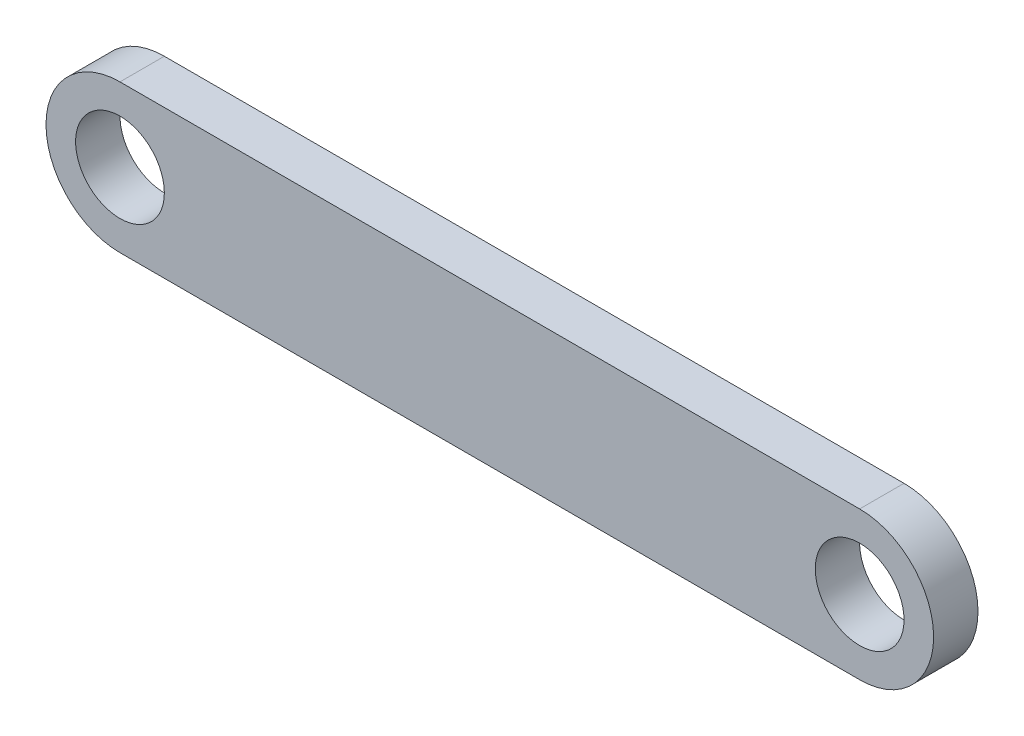
ISO-10303-21;
HEADER;
FILE_DESCRIPTION(('STEP AP214'),'2;1');
FILE_NAME('part.step','',(''),(''),'','','');
FILE_SCHEMA(('AUTOMOTIVE_DESIGN { 1 0 10303 214 1 1 1 1 }'));
ENDSEC;
DATA;
#1=APPLICATION_CONTEXT('core data for automotive mechanical design processes');
#2=APPLICATION_PROTOCOL_DEFINITION('international standard','automotive_design',2000,#1);
#3=PRODUCT_CONTEXT('',#1,'mechanical');
#4=PRODUCT('Part','Part','',(#3));
#5=PRODUCT_RELATED_PRODUCT_CATEGORY('part','',(#4));
#6=PRODUCT_DEFINITION_FORMATION('','',#4);
#7=PRODUCT_DEFINITION_CONTEXT('part definition',#1,'design');
#8=PRODUCT_DEFINITION('design','',#6,#7);
#9=PRODUCT_DEFINITION_SHAPE('','',#8);
#10=(LENGTH_UNIT() NAMED_UNIT(*) SI_UNIT(.MILLI.,.METRE.));
#11=(NAMED_UNIT(*) PLANE_ANGLE_UNIT() SI_UNIT($,.RADIAN.));
#12=(NAMED_UNIT(*) SI_UNIT($,.STERADIAN.) SOLID_ANGLE_UNIT());
#13=UNCERTAINTY_MEASURE_WITH_UNIT(LENGTH_MEASURE(1.E-05),#10,'distance_accuracy_value','');
#14=(GEOMETRIC_REPRESENTATION_CONTEXT(3) GLOBAL_UNCERTAINTY_ASSIGNED_CONTEXT((#13)) GLOBAL_UNIT_ASSIGNED_CONTEXT((#10,
#11,#12)) REPRESENTATION_CONTEXT('',''));
#15=CARTESIAN_POINT('',(0.,0.,0.));
#16=DIRECTION('',(0.,0.,1.));
#17=DIRECTION('',(1.,0.,0.));
#18=AXIS2_PLACEMENT_3D('',#15,#16,#17);
#19=CARTESIAN_POINT('',(-25.,0.,3.));
#20=DIRECTION('',(0.,0.,1.));
#21=DIRECTION('',(1.,0.,0.));
#22=AXIS2_PLACEMENT_3D('',#19,#20,#21);
#23=PLANE('',#22);
#24=CARTESIAN_POINT('',(-25.,0.,3.));
#25=DIRECTION('',(0.,0.,1.));
#26=DIRECTION('',(1.,0.,0.));
#27=AXIS2_PLACEMENT_3D('',#24,#25,#26);
#28=CIRCLE('',#27,3.);
#29=CARTESIAN_POINT('',(-22.,0.,3.));
#30=VERTEX_POINT('',#29);
#31=EDGE_CURVE('E99',#30,#30,#28,.T.);
#32=ORIENTED_EDGE('',*,*,#31,.F.);
#33=EDGE_LOOP('',(#32));
#34=FACE_BOUND('',#33,.T.);
#35=CARTESIAN_POINT('',(-25.,0.,3.));
#36=DIRECTION('',(0.,0.,1.));
#37=DIRECTION('',(1.,0.,0.));
#38=AXIS2_PLACEMENT_3D('',#35,#36,#37);
#39=CIRCLE('',#38,5.);
#40=CARTESIAN_POINT('',(-25.,5.,3.));
#41=VERTEX_POINT('',#40);
#42=CARTESIAN_POINT('',(-25.,-5.,3.));
#43=VERTEX_POINT('',#42);
#44=EDGE_CURVE('E84',#41,#43,#39,.T.);
#45=ORIENTED_EDGE('',*,*,#44,.T.);
#46=DIRECTION('',(1.,0.,0.));
#47=VECTOR('',#46,1.);
#48=CARTESIAN_POINT('',(-25.,-5.,3.));
#49=LINE('',#48,#47);
#50=CARTESIAN_POINT('',(25.,-4.99999999999999,3.));
#51=VERTEX_POINT('',#50);
#52=EDGE_CURVE('E79',#43,#51,#49,.T.);
#53=ORIENTED_EDGE('',*,*,#52,.T.);
#54=CARTESIAN_POINT('',(25.,0.,3.));
#55=DIRECTION('',(0.,0.,1.));
#56=DIRECTION('',(1.,0.,0.));
#57=AXIS2_PLACEMENT_3D('',#54,#55,#56);
#58=CIRCLE('',#57,5.);
#59=CARTESIAN_POINT('',(25.,5.00000000000001,3.));
#60=VERTEX_POINT('',#59);
#61=EDGE_CURVE('E82',#51,#60,#58,.T.);
#62=ORIENTED_EDGE('',*,*,#61,.T.);
#63=DIRECTION('',(-1.,0.,0.));
#64=VECTOR('',#63,1.);
#65=CARTESIAN_POINT('',(-25.,5.,3.));
#66=LINE('',#65,#64);
#67=EDGE_CURVE('E49',#60,#41,#66,.T.);
#68=ORIENTED_EDGE('',*,*,#67,.T.);
#69=EDGE_LOOP('',(#45,#53,#62,#68));
#70=FACE_BOUND('',#69,.T.);
#71=CARTESIAN_POINT('',(25.,0.,3.));
#72=DIRECTION('',(0.,0.,1.));
#73=DIRECTION('',(1.,0.,0.));
#74=AXIS2_PLACEMENT_3D('',#71,#72,#73);
#75=CIRCLE('',#74,3.);
#76=CARTESIAN_POINT('',(28.,0.,3.));
#77=VERTEX_POINT('',#76);
#78=EDGE_CURVE('E114',#77,#77,#75,.T.);
#79=ORIENTED_EDGE('',*,*,#78,.F.);
#80=EDGE_LOOP('',(#79));
#81=FACE_BOUND('',#80,.T.);
#82=ADVANCED_FACE('F32',(#34,#70,#81),#23,.T.);
#83=CARTESIAN_POINT('',(-25.,0.,0.));
#84=DIRECTION('',(0.,0.,1.));
#85=DIRECTION('',(1.,0.,0.));
#86=AXIS2_PLACEMENT_3D('',#83,#84,#85);
#87=PLANE('',#86);
#88=CARTESIAN_POINT('',(-25.,0.,0.));
#89=DIRECTION('',(0.,0.,1.));
#90=DIRECTION('',(1.,0.,0.));
#91=AXIS2_PLACEMENT_3D('',#88,#89,#90);
#92=CIRCLE('',#91,5.);
#93=CARTESIAN_POINT('',(-25.,5.,0.));
#94=VERTEX_POINT('',#93);
#95=CARTESIAN_POINT('',(-25.,-5.,0.));
#96=VERTEX_POINT('',#95);
#97=EDGE_CURVE('E96',#94,#96,#92,.T.);
#98=ORIENTED_EDGE('',*,*,#97,.F.);
#99=DIRECTION('',(-1.,0.,0.));
#100=VECTOR('',#99,1.);
#101=CARTESIAN_POINT('',(-25.,5.,0.));
#102=LINE('',#101,#100);
#103=CARTESIAN_POINT('',(25.,5.00000000000001,0.));
#104=VERTEX_POINT('',#103);
#105=EDGE_CURVE('E72',#104,#94,#102,.T.);
#106=ORIENTED_EDGE('',*,*,#105,.F.);
#107=CARTESIAN_POINT('',(25.,0.,0.));
#108=DIRECTION('',(0.,0.,1.));
#109=DIRECTION('',(1.,0.,0.));
#110=AXIS2_PLACEMENT_3D('',#107,#108,#109);
#111=CIRCLE('',#110,5.);
#112=CARTESIAN_POINT('',(25.,-4.99999999999999,0.));
#113=VERTEX_POINT('',#112);
#114=EDGE_CURVE('E66',#113,#104,#111,.T.);
#115=ORIENTED_EDGE('',*,*,#114,.F.);
#116=DIRECTION('',(1.,0.,0.));
#117=VECTOR('',#116,1.);
#118=CARTESIAN_POINT('',(-25.,-5.,0.));
#119=LINE('',#118,#117);
#120=EDGE_CURVE('E88',#96,#113,#119,.T.);
#121=ORIENTED_EDGE('',*,*,#120,.F.);
#122=EDGE_LOOP('',(#98,#106,#115,#121));
#123=FACE_BOUND('',#122,.T.);
#124=CARTESIAN_POINT('',(-25.,0.,0.));
#125=DIRECTION('',(0.,0.,1.));
#126=DIRECTION('',(1.,0.,0.));
#127=AXIS2_PLACEMENT_3D('',#124,#125,#126);
#128=CIRCLE('',#127,3.);
#129=CARTESIAN_POINT('',(-22.,0.,0.));
#130=VERTEX_POINT('',#129);
#131=EDGE_CURVE('E111',#130,#130,#128,.T.);
#132=ORIENTED_EDGE('',*,*,#131,.T.);
#133=EDGE_LOOP('',(#132));
#134=FACE_BOUND('',#133,.T.);
#135=CARTESIAN_POINT('',(25.,0.,0.));
#136=DIRECTION('',(0.,0.,1.));
#137=DIRECTION('',(1.,0.,0.));
#138=AXIS2_PLACEMENT_3D('',#135,#136,#137);
#139=CIRCLE('',#138,3.);
#140=CARTESIAN_POINT('',(28.,0.,0.));
#141=VERTEX_POINT('',#140);
#142=EDGE_CURVE('E117',#141,#141,#139,.T.);
#143=ORIENTED_EDGE('',*,*,#142,.T.);
#144=EDGE_LOOP('',(#143));
#145=FACE_BOUND('',#144,.T.);
#146=ADVANCED_FACE('F107',(#123,#134,#145),#87,.F.);
#147=CARTESIAN_POINT('',(-25.,0.,3.));
#148=DIRECTION('',(0.,0.,-1.));
#149=DIRECTION('',(-1.,0.,0.));
#150=AXIS2_PLACEMENT_3D('',#147,#148,#149);
#151=CYLINDRICAL_SURFACE('',#150,5.);
#152=ORIENTED_EDGE('',*,*,#97,.T.);
#153=DIRECTION('',(0.,0.,-1.));
#154=VECTOR('',#153,1.);
#155=CARTESIAN_POINT('',(-25.,-5.,3.));
#156=LINE('',#155,#154);
#157=EDGE_CURVE('E11',#43,#96,#156,.T.);
#158=ORIENTED_EDGE('',*,*,#157,.F.);
#159=ORIENTED_EDGE('',*,*,#44,.F.);
#160=DIRECTION('',(0.,0.,-1.));
#161=VECTOR('',#160,1.);
#162=CARTESIAN_POINT('',(-25.,5.,3.));
#163=LINE('',#162,#161);
#164=EDGE_CURVE('E92',#41,#94,#163,.T.);
#165=ORIENTED_EDGE('',*,*,#164,.T.);
#166=EDGE_LOOP('',(#152,#158,#159,#165));
#167=FACE_BOUND('',#166,.T.);
#168=ADVANCED_FACE('F34',(#167),#151,.T.);
#169=CARTESIAN_POINT('',(-25.,-5.,3.));
#170=DIRECTION('',(0.,1.,0.));
#171=DIRECTION('',(-1.,0.,0.));
#172=AXIS2_PLACEMENT_3D('',#169,#170,#171);
#173=PLANE('',#172);
#174=ORIENTED_EDGE('',*,*,#120,.T.);
#175=DIRECTION('',(0.,0.,-1.));
#176=VECTOR('',#175,1.);
#177=CARTESIAN_POINT('',(25.,-4.99999999999999,3.));
#178=LINE('',#177,#176);
#179=EDGE_CURVE('E41',#51,#113,#178,.T.);
#180=ORIENTED_EDGE('',*,*,#179,.F.);
#181=ORIENTED_EDGE('',*,*,#52,.F.);
#182=ORIENTED_EDGE('',*,*,#157,.T.);
#183=EDGE_LOOP('',(#174,#180,#181,#182));
#184=FACE_BOUND('',#183,.T.);
#185=ADVANCED_FACE('F87',(#184),#173,.F.);
#186=CARTESIAN_POINT('',(25.,0.,3.));
#187=DIRECTION('',(0.,0.,-1.));
#188=DIRECTION('',(-1.,0.,0.));
#189=AXIS2_PLACEMENT_3D('',#186,#187,#188);
#190=CYLINDRICAL_SURFACE('',#189,5.);
#191=ORIENTED_EDGE('',*,*,#114,.T.);
#192=DIRECTION('',(0.,0.,-1.));
#193=VECTOR('',#192,1.);
#194=CARTESIAN_POINT('',(25.,5.00000000000001,3.));
#195=LINE('',#194,#193);
#196=EDGE_CURVE('E89',#60,#104,#195,.T.);
#197=ORIENTED_EDGE('',*,*,#196,.F.);
#198=ORIENTED_EDGE('',*,*,#61,.F.);
#199=ORIENTED_EDGE('',*,*,#179,.T.);
#200=EDGE_LOOP('',(#191,#197,#198,#199));
#201=FACE_BOUND('',#200,.T.);
#202=ADVANCED_FACE('F90',(#201),#190,.T.);
#203=CARTESIAN_POINT('',(-25.,5.,3.));
#204=DIRECTION('',(0.,-1.,0.));
#205=DIRECTION('',(1.,0.,0.));
#206=AXIS2_PLACEMENT_3D('',#203,#204,#205);
#207=PLANE('',#206);
#208=ORIENTED_EDGE('',*,*,#105,.T.);
#209=ORIENTED_EDGE('',*,*,#164,.F.);
#210=ORIENTED_EDGE('',*,*,#67,.F.);
#211=ORIENTED_EDGE('',*,*,#196,.T.);
#212=EDGE_LOOP('',(#208,#209,#210,#211));
#213=FACE_BOUND('',#212,.T.);
#214=ADVANCED_FACE('F104',(#213),#207,.F.);
#215=CARTESIAN_POINT('',(-25.,0.,3.));
#216=DIRECTION('',(0.,0.,-1.));
#217=DIRECTION('',(-1.,0.,0.));
#218=AXIS2_PLACEMENT_3D('',#215,#216,#217);
#219=CYLINDRICAL_SURFACE('',#218,3.);
#220=ORIENTED_EDGE('',*,*,#31,.T.);
#221=EDGE_LOOP('',(#220));
#222=FACE_BOUND('',#221,.T.);
#223=ORIENTED_EDGE('',*,*,#131,.F.);
#224=EDGE_LOOP('',(#223));
#225=FACE_BOUND('',#224,.T.);
#226=ADVANCED_FACE('F134',(#222,#225),#219,.F.);
#227=CARTESIAN_POINT('',(25.,0.,3.));
#228=DIRECTION('',(0.,0.,-1.));
#229=DIRECTION('',(-1.,0.,0.));
#230=AXIS2_PLACEMENT_3D('',#227,#228,#229);
#231=CYLINDRICAL_SURFACE('',#230,3.);
#232=ORIENTED_EDGE('',*,*,#78,.T.);
#233=EDGE_LOOP('',(#232));
#234=FACE_BOUND('',#233,.T.);
#235=ORIENTED_EDGE('',*,*,#142,.F.);
#236=EDGE_LOOP('',(#235));
#237=FACE_BOUND('',#236,.T.);
#238=ADVANCED_FACE('F123',(#234,#237),#231,.F.);
#239=CLOSED_SHELL('',(#82,#146,#168,#185,#202,#214,#226,#238));
#240=MANIFOLD_SOLID_BREP('B2',#239);
#241=ADVANCED_BREP_SHAPE_REPRESENTATION('',(#18,#240),#14);
#242=SHAPE_DEFINITION_REPRESENTATION(#9,#241);
ENDSEC;
END-ISO-10303-21;
